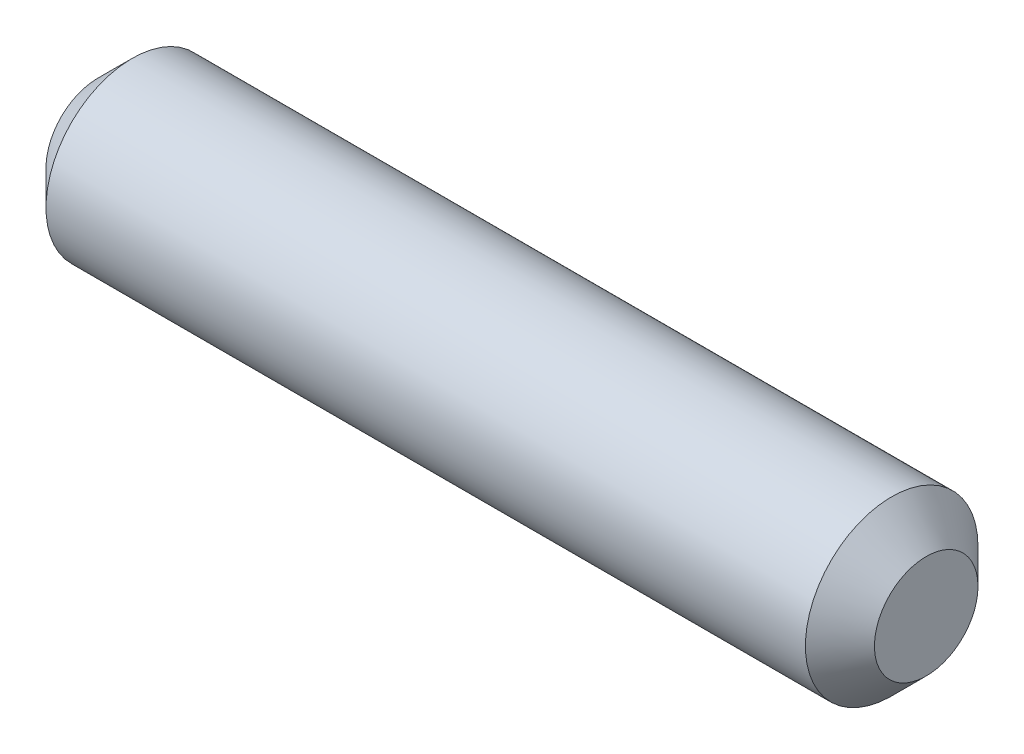
ISO-10303-21;
HEADER;
FILE_DESCRIPTION(('STEP AP214'),'2;1');
FILE_NAME('part.step','',(''),(''),'','','');
FILE_SCHEMA(('AUTOMOTIVE_DESIGN { 1 0 10303 214 1 1 1 1 }'));
ENDSEC;
DATA;
#1=APPLICATION_CONTEXT('core data for automotive mechanical design processes');
#2=APPLICATION_PROTOCOL_DEFINITION('international standard','automotive_design',2000,#1);
#3=PRODUCT_CONTEXT('',#1,'mechanical');
#4=PRODUCT('Part','Part','',(#3));
#5=PRODUCT_RELATED_PRODUCT_CATEGORY('part','',(#4));
#6=PRODUCT_DEFINITION_FORMATION('','',#4);
#7=PRODUCT_DEFINITION_CONTEXT('part definition',#1,'design');
#8=PRODUCT_DEFINITION('design','',#6,#7);
#9=PRODUCT_DEFINITION_SHAPE('','',#8);
#10=(LENGTH_UNIT() NAMED_UNIT(*) SI_UNIT(.MILLI.,.METRE.));
#11=(NAMED_UNIT(*) PLANE_ANGLE_UNIT() SI_UNIT($,.RADIAN.));
#12=(NAMED_UNIT(*) SI_UNIT($,.STERADIAN.) SOLID_ANGLE_UNIT());
#13=UNCERTAINTY_MEASURE_WITH_UNIT(LENGTH_MEASURE(1.E-05),#10,'distance_accuracy_value','');
#14=(GEOMETRIC_REPRESENTATION_CONTEXT(3) GLOBAL_UNCERTAINTY_ASSIGNED_CONTEXT((#13)) GLOBAL_UNIT_ASSIGNED_CONTEXT((#10,
#11,#12)) REPRESENTATION_CONTEXT('',''));
#15=CARTESIAN_POINT('',(0.,0.,0.));
#16=DIRECTION('',(0.,0.,1.));
#17=DIRECTION('',(1.,0.,0.));
#18=AXIS2_PLACEMENT_3D('',#15,#16,#17);
#19=CARTESIAN_POINT('',(12.,0.,0.));
#20=DIRECTION('',(-1.,0.,0.));
#21=DIRECTION('',(0.,0.,1.));
#22=AXIS2_PLACEMENT_3D('',#19,#20,#21);
#23=CYLINDRICAL_SURFACE('',#22,1.25);
#24=CARTESIAN_POINT('',(0.499999999999999,0.,0.));
#25=DIRECTION('',(1.,0.,0.));
#26=DIRECTION('',(0.,0.,-1.));
#27=AXIS2_PLACEMENT_3D('',#24,#25,#26);
#28=CIRCLE('',#27,1.25);
#29=CARTESIAN_POINT('',(0.499999999999999,0.,-1.25));
#30=VERTEX_POINT('',#29);
#31=EDGE_CURVE('E45',#30,#30,#28,.T.);
#32=ORIENTED_EDGE('',*,*,#31,.T.);
#33=EDGE_LOOP('',(#32));
#34=FACE_BOUND('',#33,.T.);
#35=CARTESIAN_POINT('',(11.5,0.,0.));
#36=DIRECTION('',(1.,0.,0.));
#37=DIRECTION('',(0.,0.,-1.));
#38=AXIS2_PLACEMENT_3D('',#35,#36,#37);
#39=CIRCLE('',#38,1.25);
#40=CARTESIAN_POINT('',(11.5,0.,-1.25));
#41=VERTEX_POINT('',#40);
#42=EDGE_CURVE('E49',#41,#41,#39,.F.);
#43=ORIENTED_EDGE('',*,*,#42,.T.);
#44=EDGE_LOOP('',(#43));
#45=FACE_BOUND('',#44,.T.);
#46=ADVANCED_FACE('F33',(#34,#45),#23,.T.);
#47=CARTESIAN_POINT('',(12.,0.,0.));
#48=DIRECTION('',(1.,0.,0.));
#49=DIRECTION('',(0.,0.,-1.));
#50=AXIS2_PLACEMENT_3D('',#47,#48,#49);
#51=PLANE('',#50);
#52=CARTESIAN_POINT('',(12.,0.,0.));
#53=DIRECTION('',(1.,0.,0.));
#54=DIRECTION('',(0.,0.,-1.));
#55=AXIS2_PLACEMENT_3D('',#52,#53,#54);
#56=CIRCLE('',#55,0.749999999999995);
#57=CARTESIAN_POINT('',(12.,0.,-0.749999999999995));
#58=VERTEX_POINT('',#57);
#59=EDGE_CURVE('E10',#58,#58,#56,.T.);
#60=ORIENTED_EDGE('',*,*,#59,.T.);
#61=EDGE_LOOP('',(#60));
#62=FACE_BOUND('',#61,.T.);
#63=ADVANCED_FACE('F65',(#62),#51,.T.);
#64=CARTESIAN_POINT('',(0.,0.,0.));
#65=DIRECTION('',(1.,0.,0.));
#66=DIRECTION('',(0.,0.,-1.));
#67=AXIS2_PLACEMENT_3D('',#64,#65,#66);
#68=PLANE('',#67);
#69=CARTESIAN_POINT('',(0.,0.,0.));
#70=DIRECTION('',(1.,0.,0.));
#71=DIRECTION('',(0.,0.,-1.));
#72=AXIS2_PLACEMENT_3D('',#69,#70,#71);
#73=CIRCLE('',#72,0.750000000000001);
#74=CARTESIAN_POINT('',(0.,0.,-0.750000000000001));
#75=VERTEX_POINT('',#74);
#76=EDGE_CURVE('E41',#75,#75,#73,.F.);
#77=ORIENTED_EDGE('',*,*,#76,.T.);
#78=EDGE_LOOP('',(#77));
#79=FACE_BOUND('',#78,.T.);
#80=ADVANCED_FACE('F62',(#79),#68,.F.);
#81=CARTESIAN_POINT('',(0.499999999999999,0.,0.));
#82=DIRECTION('',(1.,0.,0.));
#83=DIRECTION('',(0.,0.,-1.));
#84=AXIS2_PLACEMENT_3D('',#81,#82,#83);
#85=CONICAL_SURFACE('',#84,1.25,0.785398163397449);
#86=ORIENTED_EDGE('',*,*,#76,.F.);
#87=EDGE_LOOP('',(#86));
#88=FACE_BOUND('',#87,.T.);
#89=ORIENTED_EDGE('',*,*,#31,.F.);
#90=EDGE_LOOP('',(#89));
#91=FACE_BOUND('',#90,.T.);
#92=ADVANCED_FACE('F58',(#88,#91),#85,.T.);
#93=CARTESIAN_POINT('',(12.,0.,0.));
#94=DIRECTION('',(-1.,0.,0.));
#95=DIRECTION('',(0.,0.,1.));
#96=AXIS2_PLACEMENT_3D('',#93,#94,#95);
#97=CONICAL_SURFACE('',#96,0.749999999999995,0.785398163397449);
#98=ORIENTED_EDGE('',*,*,#42,.F.);
#99=EDGE_LOOP('',(#98));
#100=FACE_BOUND('',#99,.T.);
#101=ORIENTED_EDGE('',*,*,#59,.F.);
#102=EDGE_LOOP('',(#101));
#103=FACE_BOUND('',#102,.T.);
#104=ADVANCED_FACE('F36',(#100,#103),#97,.T.);
#105=CLOSED_SHELL('',(#46,#63,#80,#92,#104));
#106=MANIFOLD_SOLID_BREP('B2',#105);
#107=ADVANCED_BREP_SHAPE_REPRESENTATION('',(#18,#106),#14);
#108=SHAPE_DEFINITION_REPRESENTATION(#9,#107);
ENDSEC;
END-ISO-10303-21;
